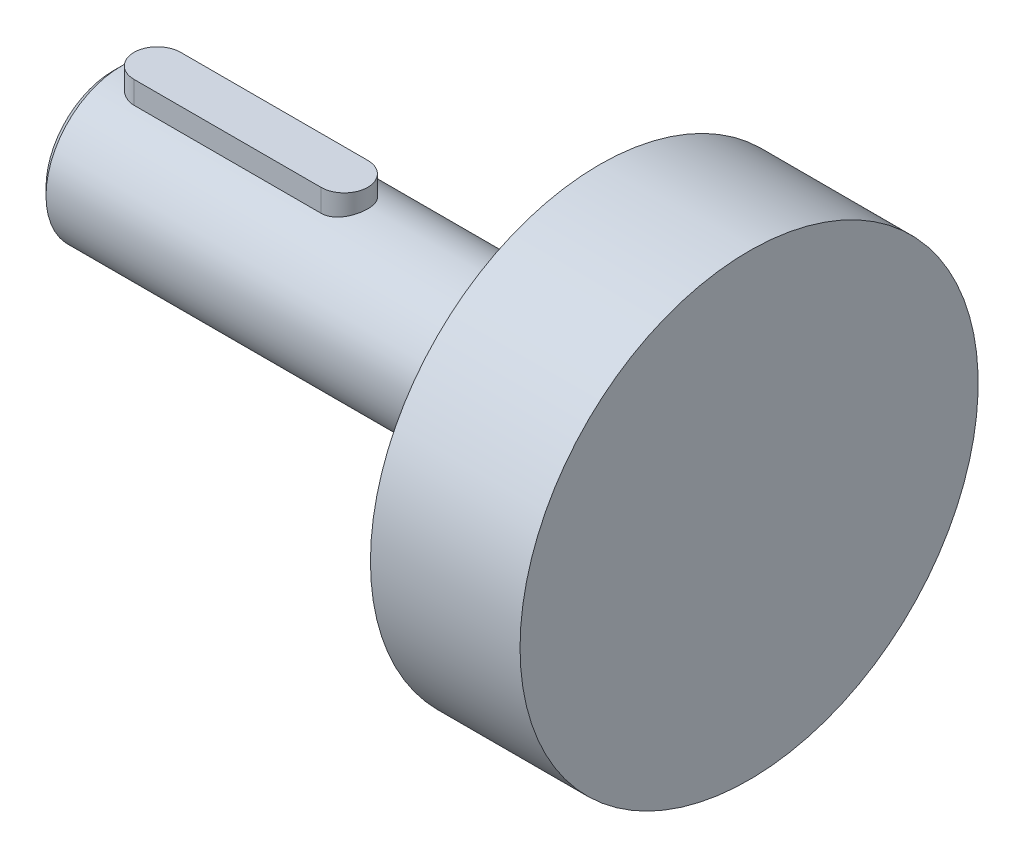
ISO-10303-21;
HEADER;
FILE_DESCRIPTION(('STEP AP214'),'2;1');
FILE_NAME('part.step','',(''),(''),'','','');
FILE_SCHEMA(('AUTOMOTIVE_DESIGN { 1 0 10303 214 1 1 1 1 }'));
ENDSEC;
DATA;
#1=APPLICATION_CONTEXT('core data for automotive mechanical design processes');
#2=APPLICATION_PROTOCOL_DEFINITION('international standard','automotive_design',2000,#1);
#3=PRODUCT_CONTEXT('',#1,'mechanical');
#4=PRODUCT('Part','Part','',(#3));
#5=PRODUCT_RELATED_PRODUCT_CATEGORY('part','',(#4));
#6=PRODUCT_DEFINITION_FORMATION('','',#4);
#7=PRODUCT_DEFINITION_CONTEXT('part definition',#1,'design');
#8=PRODUCT_DEFINITION('design','',#6,#7);
#9=PRODUCT_DEFINITION_SHAPE('','',#8);
#10=(LENGTH_UNIT() NAMED_UNIT(*) SI_UNIT(.MILLI.,.METRE.));
#11=(NAMED_UNIT(*) PLANE_ANGLE_UNIT() SI_UNIT($,.RADIAN.));
#12=(NAMED_UNIT(*) SI_UNIT($,.STERADIAN.) SOLID_ANGLE_UNIT());
#13=UNCERTAINTY_MEASURE_WITH_UNIT(LENGTH_MEASURE(1.E-05),#10,'distance_accuracy_value','');
#14=(GEOMETRIC_REPRESENTATION_CONTEXT(3) GLOBAL_UNCERTAINTY_ASSIGNED_CONTEXT((#13)) GLOBAL_UNIT_ASSIGNED_CONTEXT((#10,
#11,#12)) REPRESENTATION_CONTEXT('',''));
#15=CARTESIAN_POINT('',(0.,0.,0.));
#16=DIRECTION('',(0.,0.,1.));
#17=DIRECTION('',(1.,0.,0.));
#18=AXIS2_PLACEMENT_3D('',#15,#16,#17);
#19=CARTESIAN_POINT('',(0.,-7.39673249514342,7.2));
#20=DIRECTION('',(-1.,0.,0.));
#21=DIRECTION('',(0.,1.,0.));
#22=AXIS2_PLACEMENT_3D('',#19,#20,#21);
#23=PLANE('',#22);
#24=CARTESIAN_POINT('',(0.,0.,0.));
#25=DIRECTION('',(-1.,0.,0.));
#26=DIRECTION('',(0.,0.,-1.));
#27=AXIS2_PLACEMENT_3D('',#24,#25,#26);
#28=CIRCLE('',#27,7.2);
#29=CARTESIAN_POINT('',(0.,0.,-7.2));
#30=VERTEX_POINT('',#29);
#31=EDGE_CURVE('E214',#30,#30,#28,.F.);
#32=ORIENTED_EDGE('',*,*,#31,.F.);
#33=EDGE_LOOP('',(#32));
#34=FACE_BOUND('',#33,.T.);
#35=CARTESIAN_POINT('',(0.,0.,0.));
#36=DIRECTION('',(1.,0.,0.));
#37=DIRECTION('',(0.,-1.42053902152387E-07,0.99999999999999));
#38=AXIS2_PLACEMENT_3D('',#35,#36,#37);
#39=CIRCLE('',#38,2.5);
#40=CARTESIAN_POINT('',(0.,-3.55134755380967E-07,2.49999999999997));
#41=VERTEX_POINT('',#40);
#42=EDGE_CURVE('E210',#41,#41,#39,.T.);
#43=ORIENTED_EDGE('',*,*,#42,.T.);
#44=EDGE_LOOP('',(#43));
#45=FACE_BOUND('',#44,.T.);
#46=ADVANCED_FACE('F17',(#34,#45),#23,.T.);
#47=CARTESIAN_POINT('',(52.,-24.9551204216983,24.5));
#48=DIRECTION('',(-1.,0.,0.));
#49=DIRECTION('',(0.,1.,0.));
#50=AXIS2_PLACEMENT_3D('',#47,#48,#49);
#51=PLANE('',#50);
#52=CARTESIAN_POINT('',(52.,0.,0.));
#53=DIRECTION('',(-1.,0.,0.));
#54=DIRECTION('',(0.,0.,-1.));
#55=AXIS2_PLACEMENT_3D('',#52,#53,#54);
#56=CIRCLE('',#55,24.5);
#57=CARTESIAN_POINT('',(52.,0.,-24.5));
#58=VERTEX_POINT('',#57);
#59=EDGE_CURVE('E209',#58,#58,#56,.F.);
#60=ORIENTED_EDGE('',*,*,#59,.F.);
#61=EDGE_LOOP('',(#60));
#62=FACE_BOUND('',#61,.T.);
#63=CARTESIAN_POINT('',(52.,0.,0.));
#64=DIRECTION('',(1.,0.,0.));
#65=DIRECTION('',(0.,0.,1.));
#66=AXIS2_PLACEMENT_3D('',#63,#64,#65);
#67=CIRCLE('',#66,8.);
#68=CARTESIAN_POINT('',(52.,0.,8.));
#69=VERTEX_POINT('',#68);
#70=EDGE_CURVE('E89',#69,#69,#67,.T.);
#71=ORIENTED_EDGE('',*,*,#70,.T.);
#72=EDGE_LOOP('',(#71));
#73=FACE_BOUND('',#72,.T.);
#74=ADVANCED_FACE('F187',(#62,#73),#51,.T.);
#75=CARTESIAN_POINT('',(68.,-24.9551203790759,-24.5));
#76=DIRECTION('',(1.,0.,0.));
#77=DIRECTION('',(0.,1.,0.));
#78=AXIS2_PLACEMENT_3D('',#75,#76,#77);
#79=PLANE('',#78);
#80=CARTESIAN_POINT('',(68.,0.,0.));
#81=DIRECTION('',(1.,0.,0.));
#82=DIRECTION('',(0.,-1.16843866101831E-09,1.));
#83=AXIS2_PLACEMENT_3D('',#80,#81,#82);
#84=CIRCLE('',#83,24.5);
#85=CARTESIAN_POINT('',(68.,-2.86267471949486E-08,24.5));
#86=VERTEX_POINT('',#85);
#87=EDGE_CURVE('E86',#86,#86,#84,.T.);
#88=ORIENTED_EDGE('',*,*,#87,.T.);
#89=EDGE_LOOP('',(#88));
#90=FACE_BOUND('',#89,.T.);
#91=ADVANCED_FACE('F193',(#90),#79,.T.);
#92=CARTESIAN_POINT('',(4.71,7.59934207678533,-2.5));
#93=DIRECTION('',(0.,0.,-1.));
#94=DIRECTION('',(0.,1.,0.));
#95=AXIS2_PLACEMENT_3D('',#92,#93,#94);
#96=PLANE('',#95);
#97=DIRECTION('',(0.,-1.,0.));
#98=VECTOR('',#97,1.);
#99=CARTESIAN_POINT('',(24.71,10.,-2.5));
#100=LINE('',#99,#98);
#101=CARTESIAN_POINT('',(24.71,10.,-2.5));
#102=VERTEX_POINT('',#101);
#103=CARTESIAN_POINT('',(24.71,7.59934207678533,-2.5));
#104=VERTEX_POINT('',#103);
#105=EDGE_CURVE('E71',#102,#104,#100,.T.);
#106=ORIENTED_EDGE('',*,*,#105,.T.);
#107=DIRECTION('',(-1.,0.,0.));
#108=VECTOR('',#107,1.);
#109=CARTESIAN_POINT('',(24.71,7.59934207678533,-2.5));
#110=LINE('',#109,#108);
#111=CARTESIAN_POINT('',(4.71,7.59934207678533,-2.5));
#112=VERTEX_POINT('',#111);
#113=EDGE_CURVE('E57',#104,#112,#110,.T.);
#114=ORIENTED_EDGE('',*,*,#113,.T.);
#115=DIRECTION('',(0.,1.,0.));
#116=VECTOR('',#115,1.);
#117=CARTESIAN_POINT('',(4.71,7.59934207678533,-2.5));
#118=LINE('',#117,#116);
#119=CARTESIAN_POINT('',(4.71,10.,-2.5));
#120=VERTEX_POINT('',#119);
#121=EDGE_CURVE('E70',#120,#112,#118,.F.);
#122=ORIENTED_EDGE('',*,*,#121,.F.);
#123=DIRECTION('',(1.,0.,0.));
#124=VECTOR('',#123,1.);
#125=CARTESIAN_POINT('',(4.71,10.,-2.5));
#126=LINE('',#125,#124);
#127=EDGE_CURVE('E85',#102,#120,#126,.F.);
#128=ORIENTED_EDGE('',*,*,#127,.F.);
#129=EDGE_LOOP('',(#106,#114,#122,#128));
#130=FACE_BOUND('',#129,.T.);
#131=ADVANCED_FACE('F84',(#130),#96,.T.);
#132=CARTESIAN_POINT('',(4.71,10.,0.));
#133=DIRECTION('',(0.,-1.,0.));
#134=DIRECTION('',(0.,0.,1.));
#135=AXIS2_PLACEMENT_3D('',#132,#133,#134);
#136=CYLINDRICAL_SURFACE('',#135,2.5);
#137=ORIENTED_EDGE('',*,*,#121,.T.);
#138=CARTESIAN_POINT('',(4.71,7.59934207678533,-2.5));
#139=CARTESIAN_POINT('',(4.68127988768098,7.59934203945499,-2.50000030063382));
#140=CARTESIAN_POINT('',(4.65255989972524,7.59951066887928,-2.49950510445963));
#141=CARTESIAN_POINT('',(4.59517107895505,7.60017738803014,-2.49752635279996));
#142=CARTESIAN_POINT('',(4.56650222864615,7.60067532563229,-2.49604325367547));
#143=CARTESIAN_POINT('',(4.50924926713751,7.6019925890923,-2.4920919657587));
#144=CARTESIAN_POINT('',(4.48066513152267,7.60281181091801,-2.48962409583164));
#145=CARTESIAN_POINT('',(4.42361488468996,7.60476352160402,-2.48370807670263));
#146=CARTESIAN_POINT('',(4.39514875158533,7.6058959494666,-2.48026011837191));
#147=CARTESIAN_POINT('',(4.33836758147497,7.60846596696252,-2.47238969511463));
#148=CARTESIAN_POINT('',(4.31005253333247,7.60990353377576,-2.46796730306112));
#149=CARTESIAN_POINT('',(4.25360632852289,7.61307573941235,-2.45815488940652));
#150=CARTESIAN_POINT('',(4.22547517854467,7.61481038897964,-2.45276483280974));
#151=CARTESIAN_POINT('',(4.16942925802867,7.618568621206,-2.44102501615792));
#152=CARTESIAN_POINT('',(4.14151451796313,7.62059224380278,-2.43467512344098));
#153=CARTESIAN_POINT('',(4.08593359039613,7.62492049167743,-2.42102461869609));
#154=CARTESIAN_POINT('',(4.05826746204053,7.6272251820167,-2.41372378651854));
#155=CARTESIAN_POINT('',(4.00321548507069,7.63210687569282,-2.39818138888637));
#156=CARTESIAN_POINT('',(3.97582972811786,7.63468396515094,-2.38993952585053));
#157=CARTESIAN_POINT('',(3.9213894042406,7.64010270179877,-2.37253235639847));
#158=CARTESIAN_POINT('',(3.89433473592869,7.64294426558363,-2.36336734103393));
#159=CARTESIAN_POINT('',(3.84070677222245,7.6488526020085,-2.34417075221645));
#160=CARTESIAN_POINT('',(3.81413179576363,7.65191823519699,-2.33414352286133));
#161=CARTESIAN_POINT('',(3.76149498134526,7.6582561575299,-2.31325224629117));
#162=CARTESIAN_POINT('',(3.73543123063258,7.66152732572279,-2.30239267740016));
#163=CARTESIAN_POINT('',(3.68382304335375,7.66825926792074,-2.27985748550094));
#164=CARTESIAN_POINT('',(3.65827681952525,7.67171913913974,-2.26818568503754));
#165=CARTESIAN_POINT('',(3.60770951764107,7.6788116635038,-2.24404493315095));
#166=CARTESIAN_POINT('',(3.58268681095864,7.68244360893732,-2.23157918469146));
#167=CARTESIAN_POINT('',(3.53317220309827,7.68986342613311,-2.20586764032446));
#168=CARTESIAN_POINT('',(3.50867886204619,7.69365076293373,-2.19262446248928));
#169=CARTESIAN_POINT('',(3.46022865396819,7.70136454464891,-2.16537343105297));
#170=CARTESIAN_POINT('',(3.43627056332389,7.70529060446636,-2.15136764365531));
#171=CARTESIAN_POINT('',(3.3888967021723,7.71326503329102,-2.12260510812623));
#172=CARTESIAN_POINT('',(3.36547994969859,7.71731314408772,-2.10784990558754));
#173=CARTESIAN_POINT('',(3.31919495143462,7.72551490019354,-2.07760068007001));
#174=CARTESIAN_POINT('',(3.29632598909958,7.72966839114196,-2.0621077115342));
#175=CARTESIAN_POINT('',(3.25114325388574,7.73806415580008,-2.03039360801211));
#176=CARTESIAN_POINT('',(3.22882905249985,7.74230635601084,-2.01417306401069));
#177=CARTESIAN_POINT('',(3.18476316766001,7.75086281059404,-1.98101307199732));
#178=CARTESIAN_POINT('',(3.16301136565295,7.75517704945997,-1.96407377751864));
#179=CARTESIAN_POINT('',(3.12007839713098,7.76386087567937,-1.9294842564334));
#180=CARTESIAN_POINT('',(3.09889744366447,7.7682304828265,-1.91183377036822));
#181=CARTESIAN_POINT('',(3.05711521643917,7.77700836248597,-1.87582865462094));
#182=CARTESIAN_POINT('',(3.0365145091124,7.78141666762114,-1.857473375589));
#183=CARTESIAN_POINT('',(2.9959028771093,7.79025528303336,-1.82006439261656));
#184=CARTESIAN_POINT('',(2.97589289453714,7.79468561654736,-1.80100967141051));
#185=CARTESIAN_POINT('',(2.93647400014641,7.80355164875611,-1.76220657263194));
#186=CARTESIAN_POINT('',(2.91706642923562,7.80798733936443,-1.74245683100433));
#187=CARTESIAN_POINT('',(2.8788649535481,7.81684747448497,-1.70226763738168));
#188=CARTESIAN_POINT('',(2.86007281275788,7.82127185797351,-1.68182649513718));
#189=CARTESIAN_POINT('',(2.82311621332052,7.83009276315481,-1.64025775321393));
#190=CARTESIAN_POINT('',(2.80495396740515,7.83448914950331,-1.61912815749255));
#191=CARTESIAN_POINT('',(2.76927271579626,7.84323756274017,-1.57618522414553));
#192=CARTESIAN_POINT('',(2.75175639889538,7.84758935934763,-1.55436960533715));
#193=CARTESIAN_POINT('',(2.71738417160154,7.85623175227372,-1.51005689614727));
#194=CARTESIAN_POINT('',(2.70053145500012,7.86052200129494,-1.48755726048466));
#195=CARTESIAN_POINT('',(2.66750545103583,7.86902584503764,-1.44187870981835));
#196=CARTESIAN_POINT('',(2.65133589397194,7.87323896164137,-1.41869700848455));
#197=CARTESIAN_POINT('',(2.61979840107212,7.88154117746501,-1.37180713288696));
#198=CARTESIAN_POINT('',(2.60442968162612,7.88563039621245,-1.34809950690667));
#199=CARTESIAN_POINT('',(2.57470695181532,7.89360242283032,-1.30049975849656));
#200=CARTESIAN_POINT('',(2.56034161386567,7.89748733994141,-1.27661506257007));
#201=CARTESIAN_POINT('',(2.53260285991232,7.90505057752186,-1.22869741782235));
#202=CARTESIAN_POINT('',(2.51921838758541,7.90873102641495,-1.20467120521839));
#203=CARTESIAN_POINT('',(2.49341147048279,7.91588215399148,-1.1564913398027));
#204=CARTESIAN_POINT('',(2.48097865885373,7.91935496039731,-1.13234355577946));
#205=CARTESIAN_POINT('',(2.45704681226738,7.92608898678815,-1.08393811307249));
#206=CARTESIAN_POINT('',(2.4455381185207,7.92935229478647,-1.05968552031744));
#207=CARTESIAN_POINT('',(2.42342791773715,7.93566517882344,-1.01108485729795));
#208=CARTESIAN_POINT('',(2.41281747818782,7.93871678593104,-0.986741114730081));
#209=CARTESIAN_POINT('',(2.39247902755717,7.9446042367321,-0.937969705121076));
#210=CARTESIAN_POINT('',(2.38274282621994,7.94744203123305,-0.913545689201219));
#211=CARTESIAN_POINT('',(2.36413003312829,7.9528998235616,-0.864622692202092));
#212=CARTESIAN_POINT('',(2.35524600805243,7.95552166972325,-0.840126745503316));
#213=CARTESIAN_POINT('',(2.33831679195936,7.96054556103771,-0.791066513018401));
#214=CARTESIAN_POINT('',(2.33026493809756,7.96294932953621,-0.766504703019907));
#215=CARTESIAN_POINT('',(2.31498141943192,7.96753508189557,-0.717317285621684));
#216=CARTESIAN_POINT('',(2.30774387494382,7.96971864202433,-0.692693652266538));
#217=CARTESIAN_POINT('',(2.29407253653289,7.97386201636018,-0.643385288957461));
#218=CARTESIAN_POINT('',(2.28763365808761,7.97582323832794,-0.618702087177457));
#219=CARTESIAN_POINT('',(2.27554548503284,7.97951999601492,-0.569275684163066));
#220=CARTESIAN_POINT('',(2.26989191251535,7.98125675058701,-0.544533620447656));
#221=CARTESIAN_POINT('',(2.25936251245394,7.98450265308713,-0.494989219117719));
#222=CARTESIAN_POINT('',(2.25448322460246,7.9860128119297,-0.470187683221961));
#223=CARTESIAN_POINT('',(2.24549293086814,7.98880362094794,-0.420522919114305));
#224=CARTESIAN_POINT('',(2.24137929283747,7.99008505677898,-0.395660211584587));
#225=CARTESIAN_POINT('',(2.23391325241339,7.99241653428286,-0.345870765901651));
#226=CARTESIAN_POINT('',(2.23055905616774,7.99346712105947,-0.32094432230603));
#227=CARTESIAN_POINT('',(2.22460730402585,7.99533502933218,-0.271024367784931));
#228=CARTESIAN_POINT('',(2.22200880225912,7.99615264240538,-0.246030980560808));
#229=CARTESIAN_POINT('',(2.21756632330225,7.99755274408537,-0.195973623580201));
#230=CARTESIAN_POINT('',(2.2157222574101,7.99813526033332,-0.17090966247047));
#231=CARTESIAN_POINT('',(2.21278903687886,7.99906331845068,-0.120707383369042));
#232=CARTESIAN_POINT('',(2.21170065932647,7.99940861638078,-0.0955690154531025));
#233=CARTESIAN_POINT('',(2.21028172217452,7.99986039438618,-0.0452141090954541));
#234=CARTESIAN_POINT('',(2.20995281342499,7.99996635420368,-0.0199975194489413));
#235=CARTESIAN_POINT('',(2.21005825280861,7.99993761598861,0.0305174618833248));
#236=CARTESIAN_POINT('',(2.21049513279674,7.99980211962764,0.0558158478500908));
#237=CARTESIAN_POINT('',(2.21214012746439,7.99928862953805,0.106497647144074));
#238=CARTESIAN_POINT('',(2.21335166141936,7.99890956065838,0.131880938613848));
#239=CARTESIAN_POINT('',(2.21655648142206,7.99790708348991,0.182735140288757));
#240=CARTESIAN_POINT('',(2.21855407965713,7.99728232742393,0.208205752179702));
#241=CARTESIAN_POINT('',(2.2233440794329,7.99578662844209,0.259236319656788));
#242=CARTESIAN_POINT('',(2.22614169053644,7.99491407215393,0.284795738952345));
#243=CARTESIAN_POINT('',(2.23254728803538,7.99292091697594,0.336004541584712));
#244=CARTESIAN_POINT('',(2.23616138469292,7.99179844881048,0.361653087824311));
#245=CARTESIAN_POINT('',(2.24421802485855,7.98930360376749,0.413039415289986));
#246=CARTESIAN_POINT('',(2.24866758138793,7.98792911384546,0.438775994345752));
#247=CARTESIAN_POINT('',(2.2584156817808,7.98492834449261,0.490336056406513));
#248=CARTESIAN_POINT('',(2.26372214207767,7.98329972253735,0.516157906315688));
#249=CARTESIAN_POINT('',(2.27520701852169,7.97978879913834,0.567884317105003));
#250=CARTESIAN_POINT('',(2.28139425359858,7.97790394193138,0.593786746364358));
#251=CARTESIAN_POINT('',(2.2946660214095,7.97387861849361,0.645667988247071));
#252=CARTESIAN_POINT('',(2.30176027287038,7.97173540073686,0.671644101143493));
#253=CARTESIAN_POINT('',(2.31687372600065,7.96719149438325,0.723663979639296));
#254=CARTESIAN_POINT('',(2.32490354155004,7.96478787852101,0.749704405793525));
#255=CARTESIAN_POINT('',(2.34191798417098,7.95972096761023,0.801841445608565));
#256=CARTESIAN_POINT('',(2.35091411310403,7.95705458507026,0.827934005547968));
#257=CARTESIAN_POINT('',(2.3698932217604,7.95146115789322,0.880160972656148));
#258=CARTESIAN_POINT('',(2.37988858252537,7.94853090357211,0.906290536852852));
#259=CARTESIAN_POINT('',(2.40089982484047,7.94240402605421,0.95857299189828));
#260=CARTESIAN_POINT('',(2.4119289377741,7.93920402393367,0.984720169298467));
#261=CARTESIAN_POINT('',(2.43485331541311,7.93260500365726,1.03658620049492));
#262=CARTESIAN_POINT('',(2.44674802242584,7.92920611391426,1.06230531718712));
#263=CARTESIAN_POINT('',(2.47122142168789,7.9222765252298,1.11294662963685));
#264=CARTESIAN_POINT('',(2.48378816922182,7.91874834618291,1.13787494414005));
#265=CARTESIAN_POINT('',(2.50957434878005,7.91156889711249,1.18696499174237));
#266=CARTESIAN_POINT('',(2.52278350463671,7.90791975069148,1.21113243422746));
#267=CARTESIAN_POINT('',(2.54982951187089,7.9005110341173,1.25873122827931));
#268=CARTESIAN_POINT('',(2.56365764563159,7.89675316479966,1.28216779889586));
#269=CARTESIAN_POINT('',(2.59192237731558,7.88913859847569,1.32833451479043));
#270=CARTESIAN_POINT('',(2.60635171626586,7.88528322460636,1.35106932315442));
#271=CARTESIAN_POINT('',(2.63580513155005,7.8774854833875,1.39586108096772));
#272=CARTESIAN_POINT('',(2.65082331426393,7.87354409703391,1.4179220771598));
#273=CARTESIAN_POINT('',(2.68144586817149,7.86558605173892,1.46139325729005));
#274=CARTESIAN_POINT('',(2.69704562543935,7.86157007605329,1.482806816892));
#275=CARTESIAN_POINT('',(2.72882765639255,7.85347454575741,1.525008300064));
#276=CARTESIAN_POINT('',(2.74500651754326,7.8493954249272,1.54579887708097));
#277=CARTESIAN_POINT('',(2.77794765966854,7.84118524238745,1.5867773572462));
#278=CARTESIAN_POINT('',(2.7947076583236,7.83705441731943,1.60696714261754));
#279=CARTESIAN_POINT('',(2.82881625888853,7.82875241160208,1.64676446208711));
#280=CARTESIAN_POINT('',(2.84616364415935,7.82458132579696,1.66637305875355));
#281=CARTESIAN_POINT('',(2.88145618897206,7.81621032687026,1.70502556843334));
#282=CARTESIAN_POINT('',(2.89940113899313,7.81201042425423,1.72406967503482));
#283=CARTESIAN_POINT('',(2.93590168134803,7.80359326177088,1.76160760940254));
#284=CARTESIAN_POINT('',(2.95445801783255,7.79937598666263,1.78010071016333));
#285=CARTESIAN_POINT('',(2.99219760728417,7.79093549026213,1.81654757110244));
#286=CARTESIAN_POINT('',(3.01138250871447,7.78671228671395,1.8344996284922));
#287=CARTESIAN_POINT('',(3.05039861464369,7.77827128607326,1.86987157190874));
#288=CARTESIAN_POINT('',(3.0702323254654,7.77405359759282,1.88728871943961));
#289=CARTESIAN_POINT('',(3.11056824955129,7.76563492199061,1.92159393964712));
#290=CARTESIAN_POINT('',(3.1310737821353,7.76143419042337,1.93847817245334));
#291=CARTESIAN_POINT('',(3.17277805334106,7.75306067051402,1.97171628020102));
#292=CARTESIAN_POINT('',(3.193980879582,7.74888833805439,1.98806514164891));
#293=CARTESIAN_POINT('',(3.23710662304861,7.74058279918374,2.02022653223321));
#294=CARTESIAN_POINT('',(3.25903435013248,7.73645029876704,2.03603279476513));
#295=CARTESIAN_POINT('',(3.30363862582761,7.72823558621852,2.06709800503346));
#296=CARTESIAN_POINT('',(3.32632065756673,7.72415437606083,2.08234934587805));
#297=CARTESIAN_POINT('',(3.37246374380697,7.71605325936658,2.11228839473945));
#298=CARTESIAN_POINT('',(3.39593090100017,7.7120346903229,2.12696706040349));
#299=CARTESIAN_POINT('',(3.44367557271467,7.70407022632746,2.15573878856927));
#300=CARTESIAN_POINT('',(3.46795975017032,7.70012604485998,2.16982127024247));
#301=CARTESIAN_POINT('',(3.5172731818401,7.69233554142398,2.19731845949355));
#302=CARTESIAN_POINT('',(3.54230767261437,7.68849075509593,2.21072421326569));
#303=CARTESIAN_POINT('',(3.59273325594122,7.68099710899179,2.23663028762876));
#304=CARTESIAN_POINT('',(3.61812238706039,7.67734748778466,2.24913420539268));
#305=CARTESIAN_POINT('',(3.6692028820498,7.67025813255475,2.27322121105742));
#306=CARTESIAN_POINT('',(3.69489206156457,7.66681742839926,2.28480864531708));
#307=CARTESIAN_POINT('',(3.74656397045184,7.66015631435049,2.30707155566931));
#308=CARTESIAN_POINT('',(3.77254506109225,7.65693505781616,2.31775058141912));
#309=CARTESIAN_POINT('',(3.82479369765693,7.65072220570657,2.33820324216348));
#310=CARTESIAN_POINT('',(3.85106009663678,7.64772992480894,2.34797959857226));
#311=CARTESIAN_POINT('',(3.90387373392995,7.64198462550507,2.3666311653116));
#312=CARTESIAN_POINT('',(3.93042026147261,7.63923111484857,2.37550823629843));
#313=CARTESIAN_POINT('',(3.98378971521497,7.63397285388764,2.39236302943674));
#314=CARTESIAN_POINT('',(4.01061230966937,7.63146783648255,2.40034171851614));
#315=CARTESIAN_POINT('',(4.06453037849347,7.62671604762333,2.41539901482903));
#316=CARTESIAN_POINT('',(4.09162584074562,7.62446926475601,2.42247766184311));
#317=CARTESIAN_POINT('',(4.14608677899278,7.620243395536,2.43573152995511));
#318=CARTESIAN_POINT('',(4.17345250037608,7.61826458224649,2.44190583003102));
#319=CARTESIAN_POINT('',(4.22845147435132,7.61458407685373,2.45334497934624));
#320=CARTESIAN_POINT('',(4.25608516453286,7.61288296883251,2.45860791313584));
#321=CARTESIAN_POINT('',(4.31161770245241,7.60976727071603,2.46821556704902));
#322=CARTESIAN_POINT('',(4.33951711110076,7.60835359957258,2.47255734404694));
#323=CARTESIAN_POINT('',(4.39557854273516,7.60582215761372,2.48031112288614));
#324=CARTESIAN_POINT('',(4.42374117717575,7.60470566142183,2.48371912140501));
#325=CARTESIAN_POINT('',(4.48032605635482,7.60277790194144,2.48959098388039));
#326=CARTESIAN_POINT('',(4.50874888613722,7.60196828613272,2.49204975319219));
#327=CARTESIAN_POINT('',(4.56585041462898,7.60066371885223,2.49600581872194));
#328=CARTESIAN_POINT('',(4.59452959077565,7.60017080199973,2.49749689866517));
#329=CARTESIAN_POINT('',(4.65213896263992,7.59950862041283,2.49949782427188));
#330=CARTESIAN_POINT('',(4.68106944207322,7.59934178408274,2.50000030778875));
#331=CARTESIAN_POINT('',(4.71,7.59934207678533,2.5));
#332=B_SPLINE_CURVE_WITH_KNOTS('',3,(#138,#139,#140,#141,#142,#143,#144,#145,#146,#147,#148,
#149,#150,#151,#152,#153,#154,#155,#156,#157,#158,#159,#160,#161,#162,#163,#164,#165,#166,#167,
#168,#169,#170,#171,#172,#173,#174,#175,#176,#177,#178,#179,#180,#181,#182,#183,#184,#185,#186,
#187,#188,#189,#190,#191,#192,#193,#194,#195,#196,#197,#198,#199,#200,#201,#202,#203,#204,#205,
#206,#207,#208,#209,#210,#211,#212,#213,#214,#215,#216,#217,#218,#219,#220,#221,#222,#223,#224,
#225,#226,#227,#228,#229,#230,#231,#232,#233,#234,#235,#236,#237,#238,#239,#240,#241,#242,#243,
#244,#245,#246,#247,#248,#249,#250,#251,#252,#253,#254,#255,#256,#257,#258,#259,#260,#261,#262,
#263,#264,#265,#266,#267,#268,#269,#270,#271,#272,#273,#274,#275,#276,#277,#278,#279,#280,#281,
#282,#283,#284,#285,#286,#287,#288,#289,#290,#291,#292,#293,#294,#295,#296,#297,#298,#299,#300,
#301,#302,#303,#304,#305,#306,#307,#308,#309,#310,#311,#312,#313,#314,#315,#316,#317,#318,#319,
#320,#321,#322,#323,#324,#325,#326,#327,#328,#329,#330,#331),.UNSPECIFIED.,.F.,.F.,(4,2,2,2,2,2,
2,2,2,2,2,2,2,2,2,2,2,2,2,2,2,2,2,2,2,2,2,2,2,2,2,2,2,2,2,2,2,2,2,2,2,2,2,2,2,2,2,2,2,2,2,2,2,2,
2,2,2,2,2,2,2,2,2,2,2,2,2,2,2,2,2,2,2,2,2,2,2,2,2,2,2,2,2,2,2,2,2,2,2,2,2,2,2,2,2,2,4),(0.,
0.0861553884510273,0.172271005064395,0.258358760351749,0.344429761608911,0.430494328228866,
0.516562008011096,0.602641594368185,0.688741144333572,0.774867997277955,0.860967780620772,
0.946656679820666,1.03191315386216,1.11679247379475,1.20134874938903,1.28563500832834,
1.36970328382529,1.45360470988224,1.53738962333437,1.62110767174729,1.70480792618808,
1.78853899784983,1.87234915748349,1.95628645657765,2.04039884922505,2.12473431362482,
2.20934097218923,2.29426720925433,2.37956178543352,2.46527394770185,2.55090060298549,
2.63530874184213,2.71853730933964,2.80066723238118,2.88177984348173,2.96195689429278,
3.04128056570163,3.11983347406744,3.19769867320364,3.27495965178068,3.35170032590393,
3.428005026718,3.50395848299736,3.57964579880131,3.65515242639392,3.73056413475283,
3.80596697410764,3.881447237056,3.95709141689634,4.03298616388774,4.10921824019533,
4.18587447430285,4.26304171567081,4.34080679039076,4.41925645853494,4.49847737382948,
4.57855604619253,4.65957880758029,4.74163178147941,4.82480085627767,4.909171662641,
4.99482829720988,5.08043022460643,5.16483056507613,5.24816248077783,5.33055833105899,
5.41214970444716,5.49306746511177,5.57344181351956,5.65340236051479,5.73307821356801,
5.8125980734803,5.89209033942973,5.97168321992861,6.05150484704027,6.13168339109779,
6.21234717317807,6.29362477271098,6.37564512783613,6.45853762644214,6.54243218621548,
6.62745932246258,6.71341342270394,6.7990031709667,6.88415906938431,6.96896526427459,
7.05350680832835,7.13786969802912,7.22214090208322,7.30640838017362,7.39076109153966,
7.47528899309668,7.56008302703718,7.64523509809062,7.73083804085287,7.81698557781923,
7.90377226895842),.UNSPECIFIED.);
#333=CARTESIAN_POINT('',(4.71,7.59934207678533,2.5));
#334=VERTEX_POINT('',#333);
#335=EDGE_CURVE('E64',#112,#334,#332,.T.);
#336=ORIENTED_EDGE('',*,*,#335,.T.);
#337=DIRECTION('',(0.,1.,0.));
#338=VECTOR('',#337,1.);
#339=CARTESIAN_POINT('',(4.71,7.59934207678533,2.5));
#340=LINE('',#339,#338);
#341=CARTESIAN_POINT('',(4.71,10.,2.5));
#342=VERTEX_POINT('',#341);
#343=EDGE_CURVE('E111',#342,#334,#340,.F.);
#344=ORIENTED_EDGE('',*,*,#343,.F.);
#345=CARTESIAN_POINT('',(4.71,10.,0.));
#346=DIRECTION('',(0.,-1.,0.));
#347=DIRECTION('',(0.,0.,1.));
#348=AXIS2_PLACEMENT_3D('',#345,#346,#347);
#349=CIRCLE('',#348,2.5);
#350=EDGE_CURVE('E310',#120,#342,#349,.F.);
#351=ORIENTED_EDGE('',*,*,#350,.F.);
#352=EDGE_LOOP('',(#137,#336,#344,#351));
#353=FACE_BOUND('',#352,.T.);
#354=ADVANCED_FACE('F113',(#353),#136,.T.);
#355=CARTESIAN_POINT('',(24.71,7.59934207678533,2.5));
#356=DIRECTION('',(0.,0.,1.));
#357=DIRECTION('',(0.,1.,0.));
#358=AXIS2_PLACEMENT_3D('',#355,#356,#357);
#359=PLANE('',#358);
#360=ORIENTED_EDGE('',*,*,#343,.T.);
#361=DIRECTION('',(1.,0.,0.));
#362=VECTOR('',#361,1.);
#363=CARTESIAN_POINT('',(4.71,7.59934207678533,2.5));
#364=LINE('',#363,#362);
#365=CARTESIAN_POINT('',(24.71,7.59934207678533,2.5));
#366=VERTEX_POINT('',#365);
#367=EDGE_CURVE('E311',#334,#366,#364,.T.);
#368=ORIENTED_EDGE('',*,*,#367,.T.);
#369=DIRECTION('',(0.,1.,0.));
#370=VECTOR('',#369,1.);
#371=CARTESIAN_POINT('',(24.71,7.59934207678533,2.5));
#372=LINE('',#371,#370);
#373=CARTESIAN_POINT('',(24.71,10.,2.5));
#374=VERTEX_POINT('',#373);
#375=EDGE_CURVE('E79',#374,#366,#372,.F.);
#376=ORIENTED_EDGE('',*,*,#375,.F.);
#377=DIRECTION('',(-1.,0.,0.));
#378=VECTOR('',#377,1.);
#379=CARTESIAN_POINT('',(24.71,10.,2.5));
#380=LINE('',#379,#378);
#381=EDGE_CURVE('E35',#342,#374,#380,.F.);
#382=ORIENTED_EDGE('',*,*,#381,.F.);
#383=EDGE_LOOP('',(#360,#368,#376,#382));
#384=FACE_BOUND('',#383,.T.);
#385=ADVANCED_FACE('F123',(#384),#359,.T.);
#386=CARTESIAN_POINT('',(24.71,10.,0.));
#387=DIRECTION('',(0.,-1.,0.));
#388=DIRECTION('',(0.,0.,-1.));
#389=AXIS2_PLACEMENT_3D('',#386,#387,#388);
#390=CYLINDRICAL_SURFACE('',#389,2.5);
#391=ORIENTED_EDGE('',*,*,#375,.T.);
#392=CARTESIAN_POINT('',(24.71,7.59934207678533,2.5));
#393=CARTESIAN_POINT('',(24.738720112319,7.59934203945499,2.50000030063382));
#394=CARTESIAN_POINT('',(24.7674401002748,7.59951066887928,2.49950510445963));
#395=CARTESIAN_POINT('',(24.824828921045,7.60017738803014,2.49752635279996));
#396=CARTESIAN_POINT('',(24.8534977713539,7.60067532563229,2.49604325367547));
#397=CARTESIAN_POINT('',(24.9107507328625,7.6019925890923,2.4920919657587));
#398=CARTESIAN_POINT('',(24.9393348684773,7.60281181091801,2.48962409583164));
#399=CARTESIAN_POINT('',(24.9963851153101,7.60476352160402,2.48370807670262));
#400=CARTESIAN_POINT('',(25.0248512484147,7.6058959494666,2.4802601183719));
#401=CARTESIAN_POINT('',(25.0816324185251,7.60846596696253,2.47238969511463));
#402=CARTESIAN_POINT('',(25.1099474666676,7.60990353377576,2.46796730306111));
#403=CARTESIAN_POINT('',(25.1663936714771,7.61307573941235,2.45815488940652));
#404=CARTESIAN_POINT('',(25.1945248214554,7.61481038897964,2.45276483280974));
#405=CARTESIAN_POINT('',(25.2505707419714,7.618568621206,2.44102501615792));
#406=CARTESIAN_POINT('',(25.2784854820369,7.62059224380279,2.43467512344097));
#407=CARTESIAN_POINT('',(25.3340664096039,7.62492049167744,2.42102461869609));
#408=CARTESIAN_POINT('',(25.3617325379595,7.6272251820167,2.41372378651853));
#409=CARTESIAN_POINT('',(25.4167845149294,7.63210687569283,2.39818138888636));
#410=CARTESIAN_POINT('',(25.4441702718822,7.63468396515094,2.38993952585052));
#411=CARTESIAN_POINT('',(25.4986105957594,7.64010270179878,2.37253235639846));
#412=CARTESIAN_POINT('',(25.5256652640713,7.64294426558363,2.36336734103392));
#413=CARTESIAN_POINT('',(25.5792932277776,7.6488526020085,2.34417075221644));
#414=CARTESIAN_POINT('',(25.6058682042364,7.65191823519699,2.33414352286131));
#415=CARTESIAN_POINT('',(25.6585050186548,7.6582561575299,2.31325224629115));
#416=CARTESIAN_POINT('',(25.6845687693675,7.66152732572279,2.30239267740014));
#417=CARTESIAN_POINT('',(25.7361769566463,7.66825926792074,2.27985748550092));
#418=CARTESIAN_POINT('',(25.7617231804748,7.67171913913974,2.26818568503751));
#419=CARTESIAN_POINT('',(25.812290482359,7.67881166350381,2.24404493315092));
#420=CARTESIAN_POINT('',(25.8373131890414,7.68244360893733,2.23157918469143));
#421=CARTESIAN_POINT('',(25.8868277969018,7.68986342613312,2.20586764032443));
#422=CARTESIAN_POINT('',(25.9113211379539,7.69365076293374,2.19262446248925));
#423=CARTESIAN_POINT('',(25.9597713460319,7.70136454464892,2.16537343105293));
#424=CARTESIAN_POINT('',(25.9837294366762,7.70529060446637,2.15136764365527));
#425=CARTESIAN_POINT('',(26.0311032978278,7.71326503329103,2.12260510812619));
#426=CARTESIAN_POINT('',(26.0545200503015,7.71731314408773,2.1078499055875));
#427=CARTESIAN_POINT('',(26.1008050485655,7.72551490019355,2.07760068006996));
#428=CARTESIAN_POINT('',(26.1236740109005,7.72966839114198,2.06210771153415));
#429=CARTESIAN_POINT('',(26.1688567461143,7.73806415580009,2.03039360801206));
#430=CARTESIAN_POINT('',(26.1911709475002,7.74230635601086,2.01417306401063));
#431=CARTESIAN_POINT('',(26.2352368323401,7.75086281059405,1.98101307199726));
#432=CARTESIAN_POINT('',(26.2569886343471,7.75517704945999,1.96407377751858));
#433=CARTESIAN_POINT('',(26.2999216028691,7.76386087567939,1.92948425643333));
#434=CARTESIAN_POINT('',(26.3211025563356,7.76823048282652,1.91183377036815));
#435=CARTESIAN_POINT('',(26.3628847835609,7.77700836248599,1.87582865462087));
#436=CARTESIAN_POINT('',(26.3834854908877,7.78141666762116,1.85747337558892));
#437=CARTESIAN_POINT('',(26.4240971228908,7.79025528303337,1.82006439261648));
#438=CARTESIAN_POINT('',(26.4441071054629,7.79468561654738,1.80100967141043));
#439=CARTESIAN_POINT('',(26.4835259998537,7.80355164875613,1.76220657263185));
#440=CARTESIAN_POINT('',(26.5029335707645,7.80798733936445,1.74245683100423));
#441=CARTESIAN_POINT('',(26.541135046452,7.81684747448499,1.70226763738158));
#442=CARTESIAN_POINT('',(26.5599271872422,7.82127185797353,1.68182649513708));
#443=CARTESIAN_POINT('',(26.5968837866796,7.83009276315483,1.64025775321382));
#444=CARTESIAN_POINT('',(26.6150460325949,7.83448914950333,1.61912815749244));
#445=CARTESIAN_POINT('',(26.6507272842038,7.84323756274019,1.57618522414541));
#446=CARTESIAN_POINT('',(26.6682436011047,7.84758935934765,1.55436960533703));
#447=CARTESIAN_POINT('',(26.7026158283985,7.85623175227374,1.51005689614715));
#448=CARTESIAN_POINT('',(26.719468545,7.86052200129496,1.48755726048454));
#449=CARTESIAN_POINT('',(26.7524945489643,7.86902584503766,1.44187870981822));
#450=CARTESIAN_POINT('',(26.7686641060281,7.8732389616414,1.41869700848442));
#451=CARTESIAN_POINT('',(26.800201598928,7.88154117746503,1.37180713288683));
#452=CARTESIAN_POINT('',(26.815570318374,7.88563039621248,1.34809950690654));
#453=CARTESIAN_POINT('',(26.8452930481848,7.89360242283034,1.30049975849643));
#454=CARTESIAN_POINT('',(26.8596583861344,7.89748733994143,1.27661506256994));
#455=CARTESIAN_POINT('',(26.8873971400878,7.90505057752188,1.22869741782221));
#456=CARTESIAN_POINT('',(26.9007816124147,7.90873102641497,1.20467120521825));
#457=CARTESIAN_POINT('',(26.9265885295173,7.9158821539915,1.15649133980256));
#458=CARTESIAN_POINT('',(26.9390213411463,7.91935496039732,1.13234355577931));
#459=CARTESIAN_POINT('',(26.9629531877327,7.92608898678817,1.08393811307235));
#460=CARTESIAN_POINT('',(26.9744618814794,7.92935229478648,1.0596855203173));
#461=CARTESIAN_POINT('',(26.9965720822629,7.93566517882346,1.01108485729781));
#462=CARTESIAN_POINT('',(27.0071825218123,7.93871678593106,0.986741114729933));
#463=CARTESIAN_POINT('',(27.0275209724429,7.94460423673212,0.937969705120925));
#464=CARTESIAN_POINT('',(27.0372571737801,7.94744203123307,0.913545689201066));
#465=CARTESIAN_POINT('',(27.0558699668718,7.95289982356162,0.864622692201937));
#466=CARTESIAN_POINT('',(27.0647539919476,7.95552166972327,0.84012674550316));
#467=CARTESIAN_POINT('',(27.0816832080407,7.96054556103772,0.791066513018244));
#468=CARTESIAN_POINT('',(27.0897350619025,7.96294932953622,0.76650470301975));
#469=CARTESIAN_POINT('',(27.1050185805681,7.96753508189558,0.717317285621525));
#470=CARTESIAN_POINT('',(27.1122561250562,7.96971864202435,0.692693652266377));
#471=CARTESIAN_POINT('',(27.1259274634671,7.97386201636019,0.643385288957299));
#472=CARTESIAN_POINT('',(27.1323663419124,7.97582323832795,0.618702087177295));
#473=CARTESIAN_POINT('',(27.1444545149672,7.97951999601493,0.569275684162902));
#474=CARTESIAN_POINT('',(27.1501080874847,7.98125675058702,0.544533620447489));
#475=CARTESIAN_POINT('',(27.1606374875461,7.98450265308714,0.49498921911755));
#476=CARTESIAN_POINT('',(27.1655167753976,7.98601281192971,0.470187683221792));
#477=CARTESIAN_POINT('',(27.1745070691319,7.98880362094795,0.420522919114134));
#478=CARTESIAN_POINT('',(27.1786207071626,7.99008505677899,0.395660211584415));
#479=CARTESIAN_POINT('',(27.1860867475866,7.99241653428287,0.345870765901476));
#480=CARTESIAN_POINT('',(27.1894409438323,7.99346712105948,0.320944322305855));
#481=CARTESIAN_POINT('',(27.1953926959742,7.99533502933219,0.271024367784754));
#482=CARTESIAN_POINT('',(27.1979911977409,7.99615264240539,0.24603098056063));
#483=CARTESIAN_POINT('',(27.2024336766978,7.99755274408537,0.19597362358002));
#484=CARTESIAN_POINT('',(27.2042777425899,7.99813526033332,0.170909662470288));
#485=CARTESIAN_POINT('',(27.2072109631211,7.99906331845068,0.120707383368858));
#486=CARTESIAN_POINT('',(27.2082993406735,7.99940861638078,0.0955690154529178));
#487=CARTESIAN_POINT('',(27.2097182778255,7.99986039438618,0.0452141090952678));
#488=CARTESIAN_POINT('',(27.210047186575,7.99996635420368,0.0199975194487539));
#489=CARTESIAN_POINT('',(27.2099417471914,7.99993761598861,-0.0305174618835148));
#490=CARTESIAN_POINT('',(27.2095048672033,7.99980211962763,-0.0558158478502822));
#491=CARTESIAN_POINT('',(27.2078598725356,7.99928862953805,-0.106497647144269));
#492=CARTESIAN_POINT('',(27.2066483385806,7.99890956065838,-0.131880938614044));
#493=CARTESIAN_POINT('',(27.2034435185779,7.99790708348991,-0.182735140288955));
#494=CARTESIAN_POINT('',(27.2014459203429,7.99728232742392,-0.2082057521799));
#495=CARTESIAN_POINT('',(27.1966559205671,7.99578662844208,-0.259236319656988));
#496=CARTESIAN_POINT('',(27.1938583094635,7.99491407215392,-0.284795738952547));
#497=CARTESIAN_POINT('',(27.1874527119646,7.99292091697593,-0.336004541584915));
#498=CARTESIAN_POINT('',(27.1838386153071,7.99179844881047,-0.361653087824515));
#499=CARTESIAN_POINT('',(27.1757819751414,7.98930360376747,-0.413039415290192));
#500=CARTESIAN_POINT('',(27.171332418612,7.98792911384545,-0.438775994345959));
#501=CARTESIAN_POINT('',(27.1615843182192,7.9849283444926,-0.490336056406722));
#502=CARTESIAN_POINT('',(27.1562778579223,7.98329972253734,-0.516157906315898));
#503=CARTESIAN_POINT('',(27.1447929814783,7.97978879913832,-0.567884317105215));
#504=CARTESIAN_POINT('',(27.1386057464014,7.97790394193137,-0.59378674636457));
#505=CARTESIAN_POINT('',(27.1253339785905,7.9738786184936,-0.645667988247285));
#506=CARTESIAN_POINT('',(27.1182397271296,7.97173540073685,-0.671644101143708));
#507=CARTESIAN_POINT('',(27.1031262739993,7.96719149438323,-0.723663979639513));
#508=CARTESIAN_POINT('',(27.0950964584499,7.96478787852099,-0.749704405793742));
#509=CARTESIAN_POINT('',(27.0780820158289,7.95972096761021,-0.801841445608784));
#510=CARTESIAN_POINT('',(27.0690858868959,7.95705458507023,-0.827934005548188));
#511=CARTESIAN_POINT('',(27.0501067782395,7.9514611578932,-0.880160972656369));
#512=CARTESIAN_POINT('',(27.0401114174745,7.94853090357209,-0.906290536853075));
#513=CARTESIAN_POINT('',(27.0191001751594,7.94240402605419,-0.958572991898503));
#514=CARTESIAN_POINT('',(27.0080710622258,7.93920402393364,-0.98472016929869));
#515=CARTESIAN_POINT('',(26.9851466845868,7.93260500365723,-1.03658620049514));
#516=CARTESIAN_POINT('',(26.9732519775741,7.92920611391422,-1.06230531718734));
#517=CARTESIAN_POINT('',(26.948778578312,7.92227652522977,-1.11294662963707));
#518=CARTESIAN_POINT('',(26.9362118307781,7.91874834618288,-1.13787494414026));
#519=CARTESIAN_POINT('',(26.9104256512198,7.91156889711246,-1.18696499174257));
#520=CARTESIAN_POINT('',(26.8972164953632,7.90791975069145,-1.21113243422766));
#521=CARTESIAN_POINT('',(26.870170488129,7.90051103411727,-1.2587312282795));
#522=CARTESIAN_POINT('',(26.8563423543683,7.89675316479963,-1.28216779889604));
#523=CARTESIAN_POINT('',(26.8280776226843,7.88913859847566,-1.3283345147906));
#524=CARTESIAN_POINT('',(26.813648283734,7.88528322460633,-1.35106932315459));
#525=CARTESIAN_POINT('',(26.7841948684499,7.87748548338747,-1.39586108096788));
#526=CARTESIAN_POINT('',(26.769176685736,7.87354409703388,-1.41792207715996));
#527=CARTESIAN_POINT('',(26.7385541318284,7.86558605173889,-1.46139325729019));
#528=CARTESIAN_POINT('',(26.7229543745606,7.86157007605326,-1.48280681689214));
#529=CARTESIAN_POINT('',(26.6911723436074,7.85347454575739,-1.52500830006412));
#530=CARTESIAN_POINT('',(26.6749934824566,7.84939542492718,-1.54579887708109));
#531=CARTESIAN_POINT('',(26.6420523403314,7.84118524238743,-1.58677735724631));
#532=CARTESIAN_POINT('',(26.6252923416763,7.8370544173194,-1.60696714261764));
#533=CARTESIAN_POINT('',(26.5911837411114,7.82875241160206,-1.6467644620872));
#534=CARTESIAN_POINT('',(26.5738363558406,7.82458132579695,-1.66637305875364));
#535=CARTESIAN_POINT('',(26.5385438110279,7.81621032687025,-1.70502556843341));
#536=CARTESIAN_POINT('',(26.5205988610068,7.81201042425421,-1.72406967503489));
#537=CARTESIAN_POINT('',(26.4840983186519,7.80359326177087,-1.7616076094026));
#538=CARTESIAN_POINT('',(26.4655419821674,7.79937598666262,-1.78010071016338));
#539=CARTESIAN_POINT('',(26.4278023927158,7.79093549026212,-1.81654757110249));
#540=CARTESIAN_POINT('',(26.4086174912855,7.78671228671394,-1.83449962849224));
#541=CARTESIAN_POINT('',(26.3696013853563,7.77827128607326,-1.86987157190877));
#542=CARTESIAN_POINT('',(26.3497676745346,7.77405359759281,-1.88728871943964));
#543=CARTESIAN_POINT('',(26.3094317504487,7.7656349219906,-1.92159393964714));
#544=CARTESIAN_POINT('',(26.2889262178647,7.76143419042336,-1.93847817245336));
#545=CARTESIAN_POINT('',(26.2472219466589,7.75306067051401,-1.97171628020103));
#546=CARTESIAN_POINT('',(26.226019120418,7.74888833805439,-1.98806514164892));
#547=CARTESIAN_POINT('',(26.1828933769514,7.74058279918374,-2.02022653223321));
#548=CARTESIAN_POINT('',(26.1609656498675,7.73645029876704,-2.03603279476513));
#549=CARTESIAN_POINT('',(26.1163613741724,7.72823558621853,-2.06709800503346));
#550=CARTESIAN_POINT('',(26.0936793424333,7.72415437606083,-2.08234934587805));
#551=CARTESIAN_POINT('',(26.047536256193,7.71605325936658,-2.11228839473944));
#552=CARTESIAN_POINT('',(26.0240690989998,7.7120346903229,-2.12696706040349));
#553=CARTESIAN_POINT('',(25.9763244272853,7.70407022632746,-2.15573878856926));
#554=CARTESIAN_POINT('',(25.9520402498297,7.70012604485998,-2.16982127024246));
#555=CARTESIAN_POINT('',(25.9027268181599,7.69233554142399,-2.19731845949354));
#556=CARTESIAN_POINT('',(25.8776923273856,7.68849075509593,-2.21072421326568));
#557=CARTESIAN_POINT('',(25.8272667440588,7.6809971089918,-2.23663028762875));
#558=CARTESIAN_POINT('',(25.8018776129396,7.67734748778466,-2.24913420539267));
#559=CARTESIAN_POINT('',(25.7507971179502,7.67025813255476,-2.27322121105742));
#560=CARTESIAN_POINT('',(25.7251079384354,7.66681742839927,-2.28480864531707));
#561=CARTESIAN_POINT('',(25.6734360295482,7.66015631435049,-2.3070715556693));
#562=CARTESIAN_POINT('',(25.6474549389078,7.65693505781617,-2.31775058141911));
#563=CARTESIAN_POINT('',(25.5952063023431,7.65072220570657,-2.33820324216347));
#564=CARTESIAN_POINT('',(25.5689399033632,7.64772992480894,-2.34797959857226));
#565=CARTESIAN_POINT('',(25.5161262660701,7.64198462550507,-2.3666311653116));
#566=CARTESIAN_POINT('',(25.4895797385274,7.63923111484858,-2.37550823629842));
#567=CARTESIAN_POINT('',(25.436210284785,7.63397285388765,-2.39236302943674));
#568=CARTESIAN_POINT('',(25.4093876903306,7.63146783648255,-2.40034171851614));
#569=CARTESIAN_POINT('',(25.3554696215066,7.62671604762333,-2.41539901482903));
#570=CARTESIAN_POINT('',(25.3283741592544,7.62446926475601,-2.42247766184311));
#571=CARTESIAN_POINT('',(25.2739132210072,7.620243395536,-2.4357315299551));
#572=CARTESIAN_POINT('',(25.2465474996239,7.61826458224649,-2.44190583003102));
#573=CARTESIAN_POINT('',(25.1915485256487,7.61458407685373,-2.45334497934623));
#574=CARTESIAN_POINT('',(25.1639148354672,7.61288296883251,-2.45860791313584));
#575=CARTESIAN_POINT('',(25.1083822975476,7.60976727071603,-2.46821556704902));
#576=CARTESIAN_POINT('',(25.0804828888992,7.60835359957258,-2.47255734404693));
#577=CARTESIAN_POINT('',(25.0244214572649,7.60582215761372,-2.48031112288614));
#578=CARTESIAN_POINT('',(24.9962588228243,7.60470566142183,-2.48371912140501));
#579=CARTESIAN_POINT('',(24.9396739436452,7.60277790194144,-2.48959098388039));
#580=CARTESIAN_POINT('',(24.9112511138628,7.60196828613272,-2.49204975319219));
#581=CARTESIAN_POINT('',(24.854149585371,7.60066371885223,-2.49600581872194));
#582=CARTESIAN_POINT('',(24.8254704092244,7.60017080199973,-2.49749689866517));
#583=CARTESIAN_POINT('',(24.7678610373601,7.59950862041283,-2.49949782427188));
#584=CARTESIAN_POINT('',(24.7389305579268,7.59934178408274,-2.50000030778875));
#585=CARTESIAN_POINT('',(24.71,7.59934207678533,-2.5));
#586=B_SPLINE_CURVE_WITH_KNOTS('',3,(#392,#393,#394,#395,#396,#397,#398,#399,#400,#401,#402,
#403,#404,#405,#406,#407,#408,#409,#410,#411,#412,#413,#414,#415,#416,#417,#418,#419,#420,#421,
#422,#423,#424,#425,#426,#427,#428,#429,#430,#431,#432,#433,#434,#435,#436,#437,#438,#439,#440,
#441,#442,#443,#444,#445,#446,#447,#448,#449,#450,#451,#452,#453,#454,#455,#456,#457,#458,#459,
#460,#461,#462,#463,#464,#465,#466,#467,#468,#469,#470,#471,#472,#473,#474,#475,#476,#477,#478,
#479,#480,#481,#482,#483,#484,#485,#486,#487,#488,#489,#490,#491,#492,#493,#494,#495,#496,#497,
#498,#499,#500,#501,#502,#503,#504,#505,#506,#507,#508,#509,#510,#511,#512,#513,#514,#515,#516,
#517,#518,#519,#520,#521,#522,#523,#524,#525,#526,#527,#528,#529,#530,#531,#532,#533,#534,#535,
#536,#537,#538,#539,#540,#541,#542,#543,#544,#545,#546,#547,#548,#549,#550,#551,#552,#553,#554,
#555,#556,#557,#558,#559,#560,#561,#562,#563,#564,#565,#566,#567,#568,#569,#570,#571,#572,#573,
#574,#575,#576,#577,#578,#579,#580,#581,#582,#583,#584,#585),.UNSPECIFIED.,.F.,.F.,(4,2,2,2,2,2,
2,2,2,2,2,2,2,2,2,2,2,2,2,2,2,2,2,2,2,2,2,2,2,2,2,2,2,2,2,2,2,2,2,2,2,2,2,2,2,2,2,2,2,2,2,2,2,2,
2,2,2,2,2,2,2,2,2,2,2,2,2,2,2,2,2,2,2,2,2,2,2,2,2,2,2,2,2,2,2,2,2,2,2,2,2,2,2,2,2,2,4),(0.,
0.0861553884510342,0.172271005064403,0.258358760351758,0.34442976160893,0.430494328228886,
0.516562008011116,0.602641594368212,0.6887411443336,0.774867997277986,0.860967780620806,
0.946656679820704,1.0319131538622,1.1167924737948,1.20134874938908,1.2856350083284,
1.36970328382536,1.45360470988232,1.53738962333446,1.62110767174738,1.70480792618818,
1.78853899784993,1.87234915748361,1.95628645657777,2.04039884922517,2.12473431362496,
2.20934097218938,2.29426720925448,2.37956178543367,2.465273947702,2.55090060298565,
2.63530874184229,2.7185373093398,2.80066723238134,2.88177984348188,2.96195689429293,
3.04128056570179,3.1198334740676,3.1976986732038,3.27495965178084,3.35170032590409,
3.42800502671816,3.50395848299753,3.57964579880148,3.65515242639409,3.73056413475301,
3.80596697410782,3.88144723705617,3.95709141689652,4.03298616388793,4.10921824019552,
4.18587447430304,4.26304171567101,4.34080679039096,4.41925645853514,4.49847737382969,
4.57855604619275,4.65957880758051,4.74163178147964,4.8248008562779,4.90917166264124,
4.99482829721012,5.08043022460667,5.16483056507636,5.24816248077805,5.3305583310592,
5.41214970444735,5.49306746511195,5.57344181351973,5.65340236051493,5.73307821356814,
5.8125980734804,5.89209033942981,5.97168321992868,6.05150484704032,6.13168339109783,
6.21234717317809,6.29362477271099,6.37564512783612,6.45853762644213,6.54243218621546,
6.62745932246256,6.71341342270393,6.79900317096668,6.88415906938429,6.96896526427457,
7.05350680832834,7.13786969802911,7.22214090208321,7.3064083801736,7.39076109153964,
7.47528899309666,7.56008302703717,7.64523509809061,7.73083804085286,7.81698557781922,
7.90377226895841),.UNSPECIFIED.);
#587=EDGE_CURVE('E60',#366,#104,#586,.T.);
#588=ORIENTED_EDGE('',*,*,#587,.T.);
#589=ORIENTED_EDGE('',*,*,#105,.F.);
#590=CARTESIAN_POINT('',(24.71,10.,0.));
#591=DIRECTION('',(0.,-1.,0.));
#592=DIRECTION('',(0.,0.,-1.));
#593=AXIS2_PLACEMENT_3D('',#590,#591,#592);
#594=CIRCLE('',#593,2.5);
#595=EDGE_CURVE('E80',#374,#102,#594,.F.);
#596=ORIENTED_EDGE('',*,*,#595,.F.);
#597=EDGE_LOOP('',(#391,#588,#589,#596));
#598=FACE_BOUND('',#597,.T.);
#599=ADVANCED_FACE('F77',(#598),#390,.T.);
#600=CARTESIAN_POINT('',(1.96100394409026,10.,-2.5));
#601=DIRECTION('',(0.,1.,0.));
#602=DIRECTION('',(0.,0.,1.));
#603=AXIS2_PLACEMENT_3D('',#600,#601,#602);
#604=PLANE('',#603);
#605=ORIENTED_EDGE('',*,*,#127,.T.);
#606=ORIENTED_EDGE('',*,*,#350,.T.);
#607=ORIENTED_EDGE('',*,*,#381,.T.);
#608=ORIENTED_EDGE('',*,*,#595,.T.);
#609=EDGE_LOOP('',(#605,#606,#607,#608));
#610=FACE_BOUND('',#609,.T.);
#611=ADVANCED_FACE('F131',(#610),#604,.T.);
#612=CARTESIAN_POINT('',(68.,0.,0.));
#613=DIRECTION('',(1.,0.,0.));
#614=DIRECTION('',(0.,0.,1.));
#615=AXIS2_PLACEMENT_3D('',#612,#613,#614);
#616=CYLINDRICAL_SURFACE('',#615,8.);
#617=ORIENTED_EDGE('',*,*,#70,.F.);
#618=EDGE_LOOP('',(#617));
#619=FACE_BOUND('',#618,.T.);
#620=CARTESIAN_POINT('',(0.799999999999997,0.,0.));
#621=DIRECTION('',(1.,0.,0.));
#622=DIRECTION('',(0.,0.,1.));
#623=AXIS2_PLACEMENT_3D('',#620,#621,#622);
#624=CIRCLE('',#623,8.);
#625=CARTESIAN_POINT('',(0.799999999999997,0.,8.));
#626=VERTEX_POINT('',#625);
#627=EDGE_CURVE('E142',#626,#626,#624,.T.);
#628=ORIENTED_EDGE('',*,*,#627,.T.);
#629=EDGE_LOOP('',(#628));
#630=FACE_BOUND('',#629,.T.);
#631=ORIENTED_EDGE('',*,*,#335,.F.);
#632=ORIENTED_EDGE('',*,*,#113,.F.);
#633=ORIENTED_EDGE('',*,*,#587,.F.);
#634=ORIENTED_EDGE('',*,*,#367,.F.);
#635=EDGE_LOOP('',(#631,#632,#633,#634));
#636=FACE_BOUND('',#635,.T.);
#637=ADVANCED_FACE('F59',(#619,#630,#636),#616,.T.);
#638=CARTESIAN_POINT('',(0.799999999999998,0.,0.));
#639=DIRECTION('',(1.,0.,0.));
#640=DIRECTION('',(0.,0.,1.));
#641=AXIS2_PLACEMENT_3D('',#638,#639,#640);
#642=CONICAL_SURFACE('',#641,8.,0.78539816339745);
#643=ORIENTED_EDGE('',*,*,#31,.T.);
#644=EDGE_LOOP('',(#643));
#645=FACE_BOUND('',#644,.T.);
#646=ORIENTED_EDGE('',*,*,#627,.F.);
#647=EDGE_LOOP('',(#646));
#648=FACE_BOUND('',#647,.T.);
#649=ADVANCED_FACE('F158',(#645,#648),#642,.T.);
#650=CARTESIAN_POINT('',(68.,0.,0.));
#651=DIRECTION('',(1.,0.,0.));
#652=DIRECTION('',(0.,0.,1.));
#653=AXIS2_PLACEMENT_3D('',#650,#651,#652);
#654=CYLINDRICAL_SURFACE('',#653,24.5);
#655=ORIENTED_EDGE('',*,*,#87,.F.);
#656=EDGE_LOOP('',(#655));
#657=FACE_BOUND('',#656,.T.);
#658=ORIENTED_EDGE('',*,*,#59,.T.);
#659=EDGE_LOOP('',(#658));
#660=FACE_BOUND('',#659,.T.);
#661=ADVANCED_FACE('F183',(#657,#660),#654,.T.);
#662=CARTESIAN_POINT('',(0.,0.,0.));
#663=DIRECTION('',(-1.,0.,0.));
#664=DIRECTION('',(0.,0.,-1.));
#665=AXIS2_PLACEMENT_3D('',#662,#663,#664);
#666=CONICAL_SURFACE('',#665,2.5,0.785398163397449);
#667=ORIENTED_EDGE('',*,*,#42,.F.);
#668=EDGE_LOOP('',(#667));
#669=FACE_BOUND('',#668,.T.);
#670=CARTESIAN_POINT('',(0.432999999999999,0.,0.));
#671=DIRECTION('',(1.,0.,0.));
#672=DIRECTION('',(0.,0.,1.));
#673=AXIS2_PLACEMENT_3D('',#670,#671,#672);
#674=CIRCLE('',#673,2.067);
#675=CARTESIAN_POINT('',(0.432999999999999,0.,2.067));
#676=VERTEX_POINT('',#675);
#677=EDGE_CURVE('E25',#676,#676,#674,.T.);
#678=ORIENTED_EDGE('',*,*,#677,.T.);
#679=EDGE_LOOP('',(#678));
#680=FACE_BOUND('',#679,.T.);
#681=ADVANCED_FACE('F172',(#669,#680),#666,.F.);
#682=CARTESIAN_POINT('',(13.943361006092,0.,0.));
#683=DIRECTION('',(1.,0.,0.));
#684=DIRECTION('',(0.,7.69329611467892E-10,1.));
#685=AXIS2_PLACEMENT_3D('',#682,#683,#684);
#686=CYLINDRICAL_SURFACE('',#685,2.067);
#687=CARTESIAN_POINT('',(12.749977999677,0.,0.));
#688=DIRECTION('',(1.,0.,0.));
#689=DIRECTION('',(0.,0.,1.));
#690=AXIS2_PLACEMENT_3D('',#687,#688,#689);
#691=CIRCLE('',#690,2.067);
#692=CARTESIAN_POINT('',(12.749977999677,0.,2.067));
#693=VERTEX_POINT('',#692);
#694=EDGE_CURVE('E11',#693,#693,#691,.T.);
#695=ORIENTED_EDGE('',*,*,#694,.T.);
#696=EDGE_LOOP('',(#695));
#697=FACE_BOUND('',#696,.T.);
#698=ORIENTED_EDGE('',*,*,#677,.F.);
#699=EDGE_LOOP('',(#698));
#700=FACE_BOUND('',#699,.T.);
#701=ADVANCED_FACE('F174',(#697,#700),#686,.F.);
#702=CARTESIAN_POINT('',(12.749977999677,0.,0.));
#703=DIRECTION('',(-1.,0.,0.));
#704=DIRECTION('',(0.,0.,-1.));
#705=AXIS2_PLACEMENT_3D('',#702,#703,#704);
#706=CONICAL_SURFACE('',#705,2.067,1.04719755119658);
#707=ORIENTED_EDGE('',*,*,#694,.F.);
#708=EDGE_LOOP('',(#707));
#709=FACE_BOUND('',#708,.T.);
#710=CARTESIAN_POINT('',(13.943361006092,0.,0.));
#711=VERTEX_POINT('',#710);
#712=VERTEX_LOOP('',#711);
#713=FACE_BOUND('',#712,.T.);
#714=ADVANCED_FACE('F19',(#709,#713),#706,.F.);
#715=CLOSED_SHELL('',(#46,#74,#91,#131,#354,#385,#599,#611,#637,#649,#661,#681,#701,#714));
#716=MANIFOLD_SOLID_BREP('B1',#715);
#717=ADVANCED_BREP_SHAPE_REPRESENTATION('',(#18,#716),#14);
#718=SHAPE_DEFINITION_REPRESENTATION(#9,#717);
ENDSEC;
END-ISO-10303-21;
